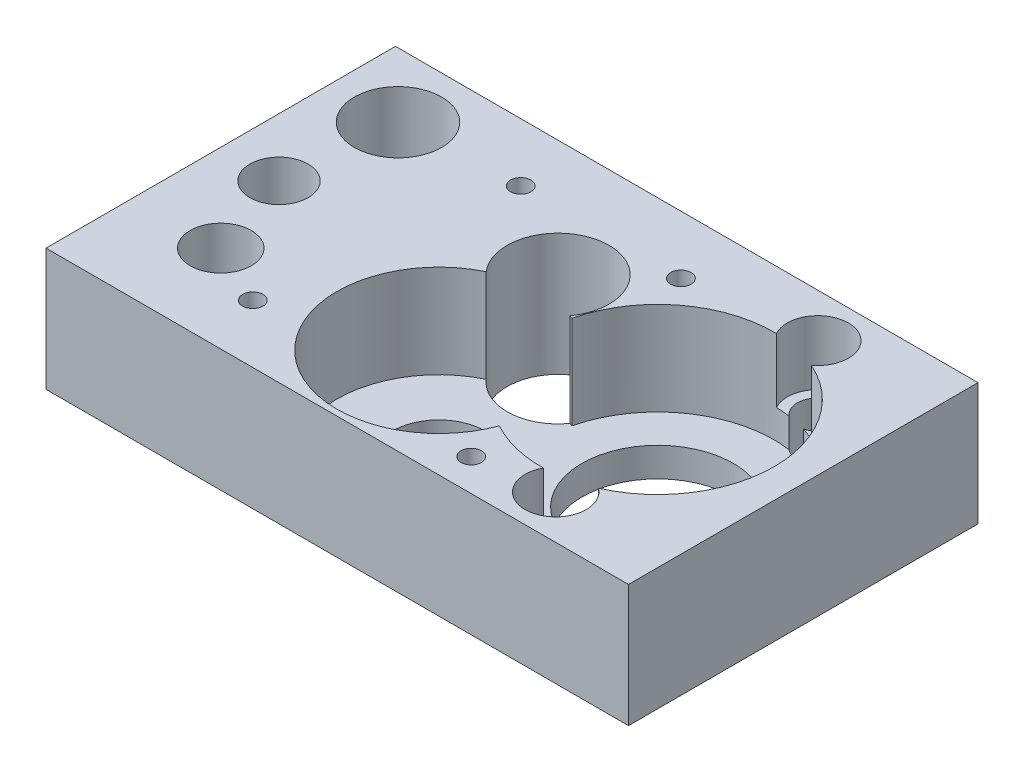
ISO-10303-21;
HEADER;
FILE_DESCRIPTION(('STEP AP214'),'2;1');
FILE_NAME('part.step','',(''),(''),'','','');
FILE_SCHEMA(('AUTOMOTIVE_DESIGN { 1 0 10303 214 1 1 1 1 }'));
ENDSEC;
DATA;
#1=APPLICATION_CONTEXT('core data for automotive mechanical design processes');
#2=APPLICATION_PROTOCOL_DEFINITION('international standard','automotive_design',2000,#1);
#3=PRODUCT_CONTEXT('',#1,'mechanical');
#4=PRODUCT('Part','Part','',(#3));
#5=PRODUCT_RELATED_PRODUCT_CATEGORY('part','',(#4));
#6=PRODUCT_DEFINITION_FORMATION('','',#4);
#7=PRODUCT_DEFINITION_CONTEXT('part definition',#1,'design');
#8=PRODUCT_DEFINITION('design','',#6,#7);
#9=PRODUCT_DEFINITION_SHAPE('','',#8);
#10=(LENGTH_UNIT() NAMED_UNIT(*) SI_UNIT(.MILLI.,.METRE.));
#11=(NAMED_UNIT(*) PLANE_ANGLE_UNIT() SI_UNIT($,.RADIAN.));
#12=(NAMED_UNIT(*) SI_UNIT($,.STERADIAN.) SOLID_ANGLE_UNIT());
#13=UNCERTAINTY_MEASURE_WITH_UNIT(LENGTH_MEASURE(1.E-05),#10,'distance_accuracy_value','');
#14=(GEOMETRIC_REPRESENTATION_CONTEXT(3) GLOBAL_UNCERTAINTY_ASSIGNED_CONTEXT((#13)) GLOBAL_UNIT_ASSIGNED_CONTEXT((#10,
#11,#12)) REPRESENTATION_CONTEXT('',''));
#15=CARTESIAN_POINT('',(0.,0.,0.));
#16=DIRECTION('',(0.,0.,1.));
#17=DIRECTION('',(1.,0.,0.));
#18=AXIS2_PLACEMENT_3D('',#15,#16,#17);
#19=CARTESIAN_POINT('',(16.,0.,10.5));
#20=DIRECTION('',(0.,1.,0.));
#21=DIRECTION('',(0.,0.,1.));
#22=AXIS2_PLACEMENT_3D('',#19,#20,#21);
#23=CYLINDRICAL_SURFACE('',#22,0.699999999999998);
#24=CARTESIAN_POINT('',(16.,0.,10.5));
#25=DIRECTION('',(0.,1.,0.));
#26=DIRECTION('',(0.,0.,1.));
#27=AXIS2_PLACEMENT_3D('',#24,#25,#26);
#28=CIRCLE('',#27,0.699999999999998);
#29=CARTESIAN_POINT('',(16.,0.,11.2));
#30=VERTEX_POINT('',#29);
#31=EDGE_CURVE('E300',#30,#30,#28,.T.);
#32=ORIENTED_EDGE('',*,*,#31,.F.);
#33=EDGE_LOOP('',(#32));
#34=FACE_BOUND('',#33,.T.);
#35=CARTESIAN_POINT('',(16.,2.,10.5));
#36=DIRECTION('',(0.,1.,0.));
#37=DIRECTION('',(0.,0.,1.));
#38=AXIS2_PLACEMENT_3D('',#35,#36,#37);
#39=CIRCLE('',#38,0.699999999999998);
#40=CARTESIAN_POINT('',(16.1772923230258,2.,9.8228239282165));
#41=VERTEX_POINT('',#40);
#42=CARTESIAN_POINT('',(15.5525900299154,2.,9.9616466600188));
#43=VERTEX_POINT('',#42);
#44=EDGE_CURVE('E155',#41,#43,#39,.F.);
#45=ORIENTED_EDGE('',*,*,#44,.F.);
#46=DIRECTION('',(0.,1.,0.));
#47=VECTOR('',#46,1.);
#48=CARTESIAN_POINT('',(16.1772923230258,2.1,9.8228239282165));
#49=LINE('',#48,#47);
#50=CARTESIAN_POINT('',(16.1772923230258,1.,9.8228239282165));
#51=VERTEX_POINT('',#50);
#52=EDGE_CURVE('E420',#41,#51,#49,.F.);
#53=ORIENTED_EDGE('',*,*,#52,.T.);
#54=CARTESIAN_POINT('',(16.,1.,10.5));
#55=DIRECTION('',(0.,1.,0.));
#56=DIRECTION('',(0.,0.,1.));
#57=AXIS2_PLACEMENT_3D('',#54,#55,#56);
#58=CIRCLE('',#57,0.699999999999998);
#59=CARTESIAN_POINT('',(15.5525900299154,1.,9.9616466600188));
#60=VERTEX_POINT('',#59);
#61=EDGE_CURVE('E335',#51,#60,#58,.T.);
#62=ORIENTED_EDGE('',*,*,#61,.T.);
#63=DIRECTION('',(0.,1.,0.));
#64=VECTOR('',#63,1.);
#65=CARTESIAN_POINT('',(15.5525900299154,2.1,9.9616466600188));
#66=LINE('',#65,#64);
#67=EDGE_CURVE('E422',#60,#43,#66,.T.);
#68=ORIENTED_EDGE('',*,*,#67,.T.);
#69=EDGE_LOOP('',(#45,#53,#62,#68));
#70=FACE_BOUND('',#69,.T.);
#71=ADVANCED_FACE('F147',(#34,#70),#23,.F.);
#72=CARTESIAN_POINT('',(16.,0.,1.5));
#73=DIRECTION('',(0.,1.,0.));
#74=DIRECTION('',(0.,0.,1.));
#75=AXIS2_PLACEMENT_3D('',#72,#73,#74);
#76=CYLINDRICAL_SURFACE('',#75,0.699999999999998);
#77=CARTESIAN_POINT('',(16.,0.,1.5));
#78=DIRECTION('',(0.,1.,0.));
#79=DIRECTION('',(0.,0.,1.));
#80=AXIS2_PLACEMENT_3D('',#77,#78,#79);
#81=CIRCLE('',#80,0.699999999999998);
#82=CARTESIAN_POINT('',(16.,0.,2.2));
#83=VERTEX_POINT('',#82);
#84=EDGE_CURVE('E328',#83,#83,#81,.T.);
#85=ORIENTED_EDGE('',*,*,#84,.F.);
#86=EDGE_LOOP('',(#85));
#87=FACE_BOUND('',#86,.T.);
#88=CARTESIAN_POINT('',(16.,2.,1.5));
#89=DIRECTION('',(0.,1.,0.));
#90=DIRECTION('',(0.,0.,1.));
#91=AXIS2_PLACEMENT_3D('',#88,#89,#90);
#92=CIRCLE('',#91,0.699999999999998);
#93=CARTESIAN_POINT('',(15.5525900299154,2.,2.03835333998121));
#94=VERTEX_POINT('',#93);
#95=CARTESIAN_POINT('',(16.1772923230257,2.,2.1771760717835));
#96=VERTEX_POINT('',#95);
#97=EDGE_CURVE('E429',#94,#96,#92,.F.);
#98=ORIENTED_EDGE('',*,*,#97,.F.);
#99=DIRECTION('',(0.,1.,0.));
#100=VECTOR('',#99,1.);
#101=CARTESIAN_POINT('',(15.5525900299154,2.1,2.03835333998121));
#102=LINE('',#101,#100);
#103=CARTESIAN_POINT('',(15.5525900299154,1.,2.03835333998121));
#104=VERTEX_POINT('',#103);
#105=EDGE_CURVE('E275',#94,#104,#102,.F.);
#106=ORIENTED_EDGE('',*,*,#105,.T.);
#107=CARTESIAN_POINT('',(16.,1.,1.5));
#108=DIRECTION('',(0.,1.,0.));
#109=DIRECTION('',(0.,0.,1.));
#110=AXIS2_PLACEMENT_3D('',#107,#108,#109);
#111=CIRCLE('',#110,0.699999999999998);
#112=CARTESIAN_POINT('',(16.1772923230257,1.,2.1771760717835));
#113=VERTEX_POINT('',#112);
#114=EDGE_CURVE('E337',#104,#113,#111,.T.);
#115=ORIENTED_EDGE('',*,*,#114,.T.);
#116=DIRECTION('',(0.,1.,0.));
#117=VECTOR('',#116,1.);
#118=CARTESIAN_POINT('',(16.1772923230257,2.1,2.1771760717835));
#119=LINE('',#118,#117);
#120=EDGE_CURVE('E426',#113,#96,#119,.T.);
#121=ORIENTED_EDGE('',*,*,#120,.T.);
#122=EDGE_LOOP('',(#98,#106,#115,#121));
#123=FACE_BOUND('',#122,.T.);
#124=ADVANCED_FACE('F485',(#87,#123),#76,.F.);
#125=CARTESIAN_POINT('',(2.3,0.,2.2141711607628));
#126=DIRECTION('',(0.,1.,0.));
#127=DIRECTION('',(0.,0.,1.));
#128=AXIS2_PLACEMENT_3D('',#125,#126,#127);
#129=CYLINDRICAL_SURFACE('',#128,0.899999999999999);
#130=CARTESIAN_POINT('',(2.3,0.,2.2141711607628));
#131=DIRECTION('',(0.,1.,0.));
#132=DIRECTION('',(0.,0.,1.));
#133=AXIS2_PLACEMENT_3D('',#130,#131,#132);
#134=CIRCLE('',#133,0.899999999999999);
#135=CARTESIAN_POINT('',(2.3,0.,3.1141711607628));
#136=VERTEX_POINT('',#135);
#137=EDGE_CURVE('E324',#136,#136,#134,.T.);
#138=ORIENTED_EDGE('',*,*,#137,.F.);
#139=EDGE_LOOP('',(#138));
#140=FACE_BOUND('',#139,.T.);
#141=CARTESIAN_POINT('',(2.3,2.,2.2141711607628));
#142=DIRECTION('',(0.,1.,0.));
#143=DIRECTION('',(0.,0.,1.));
#144=AXIS2_PLACEMENT_3D('',#141,#142,#143);
#145=CIRCLE('',#144,0.899999999999999);
#146=CARTESIAN_POINT('',(2.3,2.,3.1141711607628));
#147=VERTEX_POINT('',#146);
#148=EDGE_CURVE('E276',#147,#147,#145,.F.);
#149=ORIENTED_EDGE('',*,*,#148,.F.);
#150=EDGE_LOOP('',(#149));
#151=FACE_BOUND('',#150,.T.);
#152=ADVANCED_FACE('F491',(#140,#151),#129,.F.);
#153=CARTESIAN_POINT('',(3.,0.,9.));
#154=DIRECTION('',(0.,1.,0.));
#155=DIRECTION('',(0.,0.,1.));
#156=AXIS2_PLACEMENT_3D('',#153,#154,#155);
#157=CYLINDRICAL_SURFACE('',#156,0.699999999999999);
#158=CARTESIAN_POINT('',(3.,0.,9.));
#159=DIRECTION('',(0.,1.,0.));
#160=DIRECTION('',(0.,0.,1.));
#161=AXIS2_PLACEMENT_3D('',#158,#159,#160);
#162=CIRCLE('',#161,0.699999999999999);
#163=CARTESIAN_POINT('',(3.,0.,9.7));
#164=VERTEX_POINT('',#163);
#165=EDGE_CURVE('E325',#164,#164,#162,.T.);
#166=ORIENTED_EDGE('',*,*,#165,.F.);
#167=EDGE_LOOP('',(#166));
#168=FACE_BOUND('',#167,.T.);
#169=CARTESIAN_POINT('',(3.,2.,9.));
#170=DIRECTION('',(0.,1.,0.));
#171=DIRECTION('',(0.,0.,1.));
#172=AXIS2_PLACEMENT_3D('',#169,#170,#171);
#173=CIRCLE('',#172,0.699999999999999);
#174=CARTESIAN_POINT('',(3.,2.,9.7));
#175=VERTEX_POINT('',#174);
#176=EDGE_CURVE('E281',#175,#175,#173,.F.);
#177=ORIENTED_EDGE('',*,*,#176,.F.);
#178=EDGE_LOOP('',(#177));
#179=FACE_BOUND('',#178,.T.);
#180=ADVANCED_FACE('F498',(#168,#179),#157,.F.);
#181=CARTESIAN_POINT('',(2.,0.,6.));
#182=DIRECTION('',(0.,1.,0.));
#183=DIRECTION('',(0.,0.,1.));
#184=AXIS2_PLACEMENT_3D('',#181,#182,#183);
#185=CYLINDRICAL_SURFACE('',#184,0.7);
#186=CARTESIAN_POINT('',(2.,0.,6.));
#187=DIRECTION('',(0.,1.,0.));
#188=DIRECTION('',(0.,0.,1.));
#189=AXIS2_PLACEMENT_3D('',#186,#187,#188);
#190=CIRCLE('',#189,0.7);
#191=CARTESIAN_POINT('',(2.,0.,6.7));
#192=VERTEX_POINT('',#191);
#193=EDGE_CURVE('E321',#192,#192,#190,.T.);
#194=ORIENTED_EDGE('',*,*,#193,.F.);
#195=EDGE_LOOP('',(#194));
#196=FACE_BOUND('',#195,.T.);
#197=CARTESIAN_POINT('',(2.,2.,6.));
#198=DIRECTION('',(0.,1.,0.));
#199=DIRECTION('',(0.,0.,1.));
#200=AXIS2_PLACEMENT_3D('',#197,#198,#199);
#201=CIRCLE('',#200,0.7);
#202=CARTESIAN_POINT('',(2.,2.,6.7));
#203=VERTEX_POINT('',#202);
#204=EDGE_CURVE('E430',#203,#203,#201,.F.);
#205=ORIENTED_EDGE('',*,*,#204,.F.);
#206=EDGE_LOOP('',(#205));
#207=FACE_BOUND('',#206,.T.);
#208=ADVANCED_FACE('F509',(#196,#207),#185,.F.);
#209=CARTESIAN_POINT('',(15.,4.2,6.));
#210=DIRECTION('',(0.,-1.,0.));
#211=DIRECTION('',(0.,0.,-1.));
#212=AXIS2_PLACEMENT_3D('',#209,#210,#211);
#213=CYLINDRICAL_SURFACE('',#212,4.);
#214=DIRECTION('',(0.,1.,0.));
#215=VECTOR('',#214,1.);
#216=CARTESIAN_POINT('',(16.6239653482998,3.1,2.34449229962217));
#217=LINE('',#216,#215);
#218=CARTESIAN_POINT('',(16.6239653482998,2.,2.34449229962217));
#219=VERTEX_POINT('',#218);
#220=CARTESIAN_POINT('',(16.6239653482998,4.2,2.34449229962217));
#221=VERTEX_POINT('',#220);
#222=EDGE_CURVE('E290',#219,#221,#217,.T.);
#223=ORIENTED_EDGE('',*,*,#222,.F.);
#224=CARTESIAN_POINT('',(15.,2.,6.));
#225=DIRECTION('',(0.,1.,0.));
#226=DIRECTION('',(0.,0.,1.));
#227=AXIS2_PLACEMENT_3D('',#224,#225,#226);
#228=CIRCLE('',#227,4.);
#229=EDGE_CURVE('E270',#219,#96,#228,.T.);
#230=ORIENTED_EDGE('',*,*,#229,.T.);
#231=ORIENTED_EDGE('',*,*,#120,.F.);
#232=CARTESIAN_POINT('',(15.,1.,6.));
#233=DIRECTION('',(0.,1.,0.));
#234=DIRECTION('',(0.,0.,1.));
#235=AXIS2_PLACEMENT_3D('',#232,#233,#234);
#236=CIRCLE('',#235,4.);
#237=EDGE_CURVE('E349',#51,#113,#236,.T.);
#238=ORIENTED_EDGE('',*,*,#237,.F.);
#239=ORIENTED_EDGE('',*,*,#52,.F.);
#240=CARTESIAN_POINT('',(15.,2.,6.));
#241=DIRECTION('',(0.,1.,0.));
#242=DIRECTION('',(0.,0.,1.));
#243=AXIS2_PLACEMENT_3D('',#240,#241,#242);
#244=CIRCLE('',#243,4.);
#245=CARTESIAN_POINT('',(16.6239653482998,2.,9.65550770037783));
#246=VERTEX_POINT('',#245);
#247=EDGE_CURVE('E162',#41,#246,#244,.T.);
#248=ORIENTED_EDGE('',*,*,#247,.T.);
#249=DIRECTION('',(0.,1.,0.));
#250=VECTOR('',#249,1.);
#251=CARTESIAN_POINT('',(16.6239653482998,3.1,9.65550770037783));
#252=LINE('',#251,#250);
#253=CARTESIAN_POINT('',(16.6239653482998,4.2,9.65550770037783));
#254=VERTEX_POINT('',#253);
#255=EDGE_CURVE('E294',#254,#246,#252,.F.);
#256=ORIENTED_EDGE('',*,*,#255,.F.);
#257=CARTESIAN_POINT('',(15.,4.2,6.));
#258=DIRECTION('',(0.,1.,0.));
#259=DIRECTION('',(0.,0.,1.));
#260=AXIS2_PLACEMENT_3D('',#257,#258,#259);
#261=CIRCLE('',#260,4.);
#262=EDGE_CURVE('E344',#254,#221,#261,.T.);
#263=ORIENTED_EDGE('',*,*,#262,.T.);
#264=EDGE_LOOP('',(#223,#230,#231,#238,#239,#248,#256,#263));
#265=FACE_BOUND('',#264,.T.);
#266=ADVANCED_FACE('F453',(#265),#213,.F.);
#267=DIRECTION('',(0.,1.,0.));
#268=VECTOR('',#267,1.);
#269=CARTESIAN_POINT('',(15.0770934752296,3.1,9.99925700550452));
#270=LINE('',#269,#268);
#271=CARTESIAN_POINT('',(15.0770934752296,2.,9.99925700550453));
#272=VERTEX_POINT('',#271);
#273=CARTESIAN_POINT('',(15.0770934752296,4.2,9.99925700550452));
#274=VERTEX_POINT('',#273);
#275=EDGE_CURVE('E292',#272,#274,#270,.T.);
#276=ORIENTED_EDGE('',*,*,#275,.F.);
#277=CARTESIAN_POINT('',(15.,2.,6.));
#278=DIRECTION('',(0.,1.,0.));
#279=DIRECTION('',(0.,0.,1.));
#280=AXIS2_PLACEMENT_3D('',#277,#278,#279);
#281=CIRCLE('',#280,4.);
#282=EDGE_CURVE('E278',#272,#43,#281,.T.);
#283=ORIENTED_EDGE('',*,*,#282,.T.);
#284=ORIENTED_EDGE('',*,*,#67,.F.);
#285=CARTESIAN_POINT('',(13.0678597308533,1.,9.5024040287125));
#286=VERTEX_POINT('',#285);
#287=EDGE_CURVE('E346',#286,#60,#236,.T.);
#288=ORIENTED_EDGE('',*,*,#287,.F.);
#289=DIRECTION('',(0.,-1.,0.));
#290=VECTOR('',#289,1.);
#291=CARTESIAN_POINT('',(13.0678597308533,2.6,9.5024040287125));
#292=LINE('',#291,#290);
#293=CARTESIAN_POINT('',(13.0678597308533,4.2,9.5024040287125));
#294=VERTEX_POINT('',#293);
#295=EDGE_CURVE('E379',#294,#286,#292,.T.);
#296=ORIENTED_EDGE('',*,*,#295,.F.);
#297=EDGE_CURVE('E340',#294,#274,#261,.T.);
#298=ORIENTED_EDGE('',*,*,#297,.T.);
#299=EDGE_LOOP('',(#276,#283,#284,#288,#296,#298));
#300=FACE_BOUND('',#299,.T.);
#301=ADVANCED_FACE('F442',(#300),#213,.F.);
#302=CARTESIAN_POINT('',(0.,1.,0.));
#303=DIRECTION('',(0.,1.,0.));
#304=DIRECTION('',(0.,0.,1.));
#305=AXIS2_PLACEMENT_3D('',#302,#303,#304);
#306=PLANE('',#305);
#307=ORIENTED_EDGE('',*,*,#114,.F.);
#308=CARTESIAN_POINT('',(11.112533909139,1.,5.05787081968221));
#309=VERTEX_POINT('',#308);
#310=EDGE_CURVE('E339',#104,#309,#236,.T.);
#311=ORIENTED_EDGE('',*,*,#310,.T.);
#312=CARTESIAN_POINT('',(9.78258800671495,1.,8.29534574570485));
#313=DIRECTION('',(0.,1.,0.));
#314=DIRECTION('',(0.,0.,1.));
#315=AXIS2_PLACEMENT_3D('',#312,#313,#314);
#316=CIRCLE('',#315,3.5);
#317=CARTESIAN_POINT('',(11.0070661731994,1.,5.01652686998102));
#318=VERTEX_POINT('',#317);
#319=EDGE_CURVE('E351',#309,#318,#316,.T.);
#320=ORIENTED_EDGE('',*,*,#319,.T.);
#321=CARTESIAN_POINT('',(9.58257569495584,1.,4.));
#322=DIRECTION('',(0.,1.,0.));
#323=DIRECTION('',(0.,0.,1.));
#324=AXIS2_PLACEMENT_3D('',#321,#322,#323);
#325=CIRCLE('',#324,1.75);
#326=CARTESIAN_POINT('',(8.25871336869384,1.,5.1445036221455));
#327=VERTEX_POINT('',#326);
#328=EDGE_CURVE('E394',#327,#318,#325,.T.);
#329=ORIENTED_EDGE('',*,*,#328,.F.);
#330=EDGE_CURVE('E357',#327,#286,#316,.T.);
#331=ORIENTED_EDGE('',*,*,#330,.T.);
#332=ORIENTED_EDGE('',*,*,#287,.T.);
#333=ORIENTED_EDGE('',*,*,#61,.F.);
#334=ORIENTED_EDGE('',*,*,#237,.T.);
#335=EDGE_LOOP('',(#307,#311,#320,#329,#331,#332,#333,#334));
#336=FACE_BOUND('',#335,.T.);
#337=CARTESIAN_POINT('',(9.78258800671495,1.,8.29534574570485));
#338=DIRECTION('',(0.,1.,0.));
#339=DIRECTION('',(0.,0.,1.));
#340=AXIS2_PLACEMENT_3D('',#337,#338,#339);
#341=CIRCLE('',#340,1.6);
#342=CARTESIAN_POINT('',(9.78258800671495,1.,9.89534574570485));
#343=VERTEX_POINT('',#342);
#344=EDGE_CURVE('E382',#343,#343,#341,.T.);
#345=ORIENTED_EDGE('',*,*,#344,.F.);
#346=EDGE_LOOP('',(#345));
#347=FACE_BOUND('',#346,.T.);
#348=CARTESIAN_POINT('',(15.,1.,6.));
#349=DIRECTION('',(0.,1.,0.));
#350=DIRECTION('',(0.,0.,1.));
#351=AXIS2_PLACEMENT_3D('',#348,#349,#350);
#352=CIRCLE('',#351,2.6);
#353=CARTESIAN_POINT('',(15.,1.,8.6));
#354=VERTEX_POINT('',#353);
#355=EDGE_CURVE('E388',#354,#354,#352,.T.);
#356=ORIENTED_EDGE('',*,*,#355,.F.);
#357=EDGE_LOOP('',(#356));
#358=FACE_BOUND('',#357,.T.);
#359=ADVANCED_FACE('F449',(#336,#347,#358),#306,.T.);
#360=CARTESIAN_POINT('',(0.,0.,0.));
#361=DIRECTION('',(0.,1.,0.));
#362=DIRECTION('',(0.,0.,1.));
#363=AXIS2_PLACEMENT_3D('',#360,#361,#362);
#364=PLANE('',#363);
#365=ORIENTED_EDGE('',*,*,#193,.T.);
#366=EDGE_LOOP('',(#365));
#367=FACE_BOUND('',#366,.T.);
#368=ORIENTED_EDGE('',*,*,#165,.T.);
#369=EDGE_LOOP('',(#368));
#370=FACE_BOUND('',#369,.T.);
#371=ORIENTED_EDGE('',*,*,#84,.T.);
#372=EDGE_LOOP('',(#371));
#373=FACE_BOUND('',#372,.T.);
#374=ORIENTED_EDGE('',*,*,#31,.T.);
#375=EDGE_LOOP('',(#374));
#376=FACE_BOUND('',#375,.T.);
#377=CARTESIAN_POINT('',(5.1,0.,10.));
#378=DIRECTION('',(0.,1.,0.));
#379=DIRECTION('',(0.,0.,1.));
#380=AXIS2_PLACEMENT_3D('',#377,#378,#379);
#381=CIRCLE('',#380,0.35);
#382=CARTESIAN_POINT('',(5.1,0.,10.35));
#383=VERTEX_POINT('',#382);
#384=EDGE_CURVE('E301',#383,#383,#381,.T.);
#385=ORIENTED_EDGE('',*,*,#384,.T.);
#386=EDGE_LOOP('',(#385));
#387=FACE_BOUND('',#386,.T.);
#388=CARTESIAN_POINT('',(6.3,0.,2.));
#389=DIRECTION('',(0.,1.,0.));
#390=DIRECTION('',(0.,0.,1.));
#391=AXIS2_PLACEMENT_3D('',#388,#389,#390);
#392=CIRCLE('',#391,0.35);
#393=CARTESIAN_POINT('',(6.3,0.,2.35));
#394=VERTEX_POINT('',#393);
#395=EDGE_CURVE('E307',#394,#394,#392,.T.);
#396=ORIENTED_EDGE('',*,*,#395,.T.);
#397=EDGE_LOOP('',(#396));
#398=FACE_BOUND('',#397,.T.);
#399=CARTESIAN_POINT('',(11.8,0.,2.));
#400=DIRECTION('',(0.,1.,0.));
#401=DIRECTION('',(0.,0.,1.));
#402=AXIS2_PLACEMENT_3D('',#399,#400,#401);
#403=CIRCLE('',#402,0.349999999999999);
#404=CARTESIAN_POINT('',(11.8,0.,2.35));
#405=VERTEX_POINT('',#404);
#406=EDGE_CURVE('E313',#405,#405,#403,.T.);
#407=ORIENTED_EDGE('',*,*,#406,.T.);
#408=EDGE_LOOP('',(#407));
#409=FACE_BOUND('',#408,.T.);
#410=CARTESIAN_POINT('',(13.5,0.,10.9));
#411=DIRECTION('',(0.,1.,0.));
#412=DIRECTION('',(0.,0.,1.));
#413=AXIS2_PLACEMENT_3D('',#410,#411,#412);
#414=CIRCLE('',#413,0.349999999999999);
#415=CARTESIAN_POINT('',(13.5,0.,11.25));
#416=VERTEX_POINT('',#415);
#417=EDGE_CURVE('E296',#416,#416,#414,.T.);
#418=ORIENTED_EDGE('',*,*,#417,.T.);
#419=EDGE_LOOP('',(#418));
#420=FACE_BOUND('',#419,.T.);
#421=ORIENTED_EDGE('',*,*,#137,.T.);
#422=EDGE_LOOP('',(#421));
#423=FACE_BOUND('',#422,.T.);
#424=DIRECTION('',(0.,0.,1.));
#425=VECTOR('',#424,1.);
#426=CARTESIAN_POINT('',(0.,0.,0.));
#427=LINE('',#426,#425);
#428=CARTESIAN_POINT('',(0.,0.,0.));
#429=VERTEX_POINT('',#428);
#430=CARTESIAN_POINT('',(0.,0.,12.));
#431=VERTEX_POINT('',#430);
#432=EDGE_CURVE('E397',#429,#431,#427,.T.);
#433=ORIENTED_EDGE('',*,*,#432,.F.);
#434=DIRECTION('',(1.,0.,0.));
#435=VECTOR('',#434,1.);
#436=CARTESIAN_POINT('',(0.,0.,0.));
#437=LINE('',#436,#435);
#438=CARTESIAN_POINT('',(20.,0.,0.));
#439=VERTEX_POINT('',#438);
#440=EDGE_CURVE('E408',#429,#439,#437,.T.);
#441=ORIENTED_EDGE('',*,*,#440,.T.);
#442=DIRECTION('',(0.,0.,1.));
#443=VECTOR('',#442,1.);
#444=CARTESIAN_POINT('',(20.,0.,0.));
#445=LINE('',#444,#443);
#446=CARTESIAN_POINT('',(20.,0.,12.));
#447=VERTEX_POINT('',#446);
#448=EDGE_CURVE('E405',#439,#447,#445,.T.);
#449=ORIENTED_EDGE('',*,*,#448,.T.);
#450=DIRECTION('',(1.,0.,0.));
#451=VECTOR('',#450,1.);
#452=CARTESIAN_POINT('',(0.,0.,12.));
#453=LINE('',#452,#451);
#454=EDGE_CURVE('E402',#431,#447,#453,.T.);
#455=ORIENTED_EDGE('',*,*,#454,.F.);
#456=EDGE_LOOP('',(#433,#441,#449,#455));
#457=FACE_BOUND('',#456,.T.);
#458=CARTESIAN_POINT('',(9.58257569495584,0.,4.));
#459=DIRECTION('',(0.,1.,0.));
#460=DIRECTION('',(0.,0.,1.));
#461=AXIS2_PLACEMENT_3D('',#458,#459,#460);
#462=CIRCLE('',#461,1.75);
#463=CARTESIAN_POINT('',(9.58257569495584,0.,5.75));
#464=VERTEX_POINT('',#463);
#465=EDGE_CURVE('E391',#464,#464,#462,.T.);
#466=ORIENTED_EDGE('',*,*,#465,.T.);
#467=EDGE_LOOP('',(#466));
#468=FACE_BOUND('',#467,.T.);
#469=CARTESIAN_POINT('',(15.,0.,6.));
#470=DIRECTION('',(0.,1.,0.));
#471=DIRECTION('',(0.,0.,1.));
#472=AXIS2_PLACEMENT_3D('',#469,#470,#471);
#473=CIRCLE('',#472,2.6);
#474=CARTESIAN_POINT('',(15.,0.,8.6));
#475=VERTEX_POINT('',#474);
#476=EDGE_CURVE('E385',#475,#475,#473,.T.);
#477=ORIENTED_EDGE('',*,*,#476,.T.);
#478=EDGE_LOOP('',(#477));
#479=FACE_BOUND('',#478,.T.);
#480=CARTESIAN_POINT('',(9.78258800671495,0.,8.29534574570485));
#481=DIRECTION('',(0.,1.,0.));
#482=DIRECTION('',(0.,0.,1.));
#483=AXIS2_PLACEMENT_3D('',#480,#481,#482);
#484=CIRCLE('',#483,1.6);
#485=CARTESIAN_POINT('',(9.78258800671495,0.,9.89534574570485));
#486=VERTEX_POINT('',#485);
#487=EDGE_CURVE('E381',#486,#486,#484,.T.);
#488=ORIENTED_EDGE('',*,*,#487,.T.);
#489=EDGE_LOOP('',(#488));
#490=FACE_BOUND('',#489,.T.);
#491=ADVANCED_FACE('F514',(#367,#370,#373,#376,#387,#398,#409,#420,#423,#457,#468,#479,#490),
#364,.F.);
#492=CARTESIAN_POINT('',(0.,1.,0.));
#493=DIRECTION('',(1.,0.,0.));
#494=DIRECTION('',(0.,0.,-1.));
#495=AXIS2_PLACEMENT_3D('',#492,#493,#494);
#496=PLANE('',#495);
#497=ORIENTED_EDGE('',*,*,#432,.T.);
#498=DIRECTION('',(0.,-1.,0.));
#499=VECTOR('',#498,1.);
#500=CARTESIAN_POINT('',(0.,1.,12.));
#501=LINE('',#500,#499);
#502=CARTESIAN_POINT('',(0.,4.2,12.));
#503=VERTEX_POINT('',#502);
#504=EDGE_CURVE('E417',#503,#431,#501,.T.);
#505=ORIENTED_EDGE('',*,*,#504,.F.);
#506=DIRECTION('',(0.,0.,-1.));
#507=VECTOR('',#506,1.);
#508=CARTESIAN_POINT('',(0.,4.2,0.));
#509=LINE('',#508,#507);
#510=CARTESIAN_POINT('',(0.,4.2,0.));
#511=VERTEX_POINT('',#510);
#512=EDGE_CURVE('E365',#503,#511,#509,.T.);
#513=ORIENTED_EDGE('',*,*,#512,.T.);
#514=DIRECTION('',(0.,-1.,0.));
#515=VECTOR('',#514,1.);
#516=CARTESIAN_POINT('',(0.,1.,0.));
#517=LINE('',#516,#515);
#518=EDGE_CURVE('E411',#511,#429,#517,.T.);
#519=ORIENTED_EDGE('',*,*,#518,.T.);
#520=EDGE_LOOP('',(#497,#505,#513,#519));
#521=FACE_BOUND('',#520,.T.);
#522=ADVANCED_FACE('F149',(#521),#496,.F.);
#523=CARTESIAN_POINT('',(0.,1.,12.));
#524=DIRECTION('',(0.,0.,-1.));
#525=DIRECTION('',(-1.,0.,0.));
#526=AXIS2_PLACEMENT_3D('',#523,#524,#525);
#527=PLANE('',#526);
#528=ORIENTED_EDGE('',*,*,#454,.T.);
#529=DIRECTION('',(0.,-1.,0.));
#530=VECTOR('',#529,1.);
#531=CARTESIAN_POINT('',(20.,1.,12.));
#532=LINE('',#531,#530);
#533=CARTESIAN_POINT('',(20.,4.2,12.));
#534=VERTEX_POINT('',#533);
#535=EDGE_CURVE('E415',#534,#447,#532,.T.);
#536=ORIENTED_EDGE('',*,*,#535,.F.);
#537=DIRECTION('',(-1.,0.,0.));
#538=VECTOR('',#537,1.);
#539=CARTESIAN_POINT('',(0.,4.2,12.));
#540=LINE('',#539,#538);
#541=EDGE_CURVE('E368',#534,#503,#540,.T.);
#542=ORIENTED_EDGE('',*,*,#541,.T.);
#543=ORIENTED_EDGE('',*,*,#504,.T.);
#544=EDGE_LOOP('',(#528,#536,#542,#543));
#545=FACE_BOUND('',#544,.T.);
#546=ADVANCED_FACE('F530',(#545),#527,.F.);
#547=CARTESIAN_POINT('',(20.,1.,0.));
#548=DIRECTION('',(1.,0.,0.));
#549=DIRECTION('',(0.,0.,-1.));
#550=AXIS2_PLACEMENT_3D('',#547,#548,#549);
#551=PLANE('',#550);
#552=ORIENTED_EDGE('',*,*,#448,.F.);
#553=DIRECTION('',(0.,-1.,0.));
#554=VECTOR('',#553,1.);
#555=CARTESIAN_POINT('',(20.,1.,0.));
#556=LINE('',#555,#554);
#557=CARTESIAN_POINT('',(20.,4.2,0.));
#558=VERTEX_POINT('',#557);
#559=EDGE_CURVE('E413',#558,#439,#556,.T.);
#560=ORIENTED_EDGE('',*,*,#559,.F.);
#561=DIRECTION('',(0.,0.,-1.));
#562=VECTOR('',#561,1.);
#563=CARTESIAN_POINT('',(20.,4.2,0.));
#564=LINE('',#563,#562);
#565=EDGE_CURVE('E355',#534,#558,#564,.T.);
#566=ORIENTED_EDGE('',*,*,#565,.F.);
#567=ORIENTED_EDGE('',*,*,#535,.T.);
#568=EDGE_LOOP('',(#552,#560,#566,#567));
#569=FACE_BOUND('',#568,.T.);
#570=ADVANCED_FACE('F527',(#569),#551,.T.);
#571=CARTESIAN_POINT('',(0.,1.,0.));
#572=DIRECTION('',(0.,0.,-1.));
#573=DIRECTION('',(-1.,0.,0.));
#574=AXIS2_PLACEMENT_3D('',#571,#572,#573);
#575=PLANE('',#574);
#576=ORIENTED_EDGE('',*,*,#440,.F.);
#577=ORIENTED_EDGE('',*,*,#518,.F.);
#578=DIRECTION('',(-1.,0.,0.));
#579=VECTOR('',#578,1.);
#580=CARTESIAN_POINT('',(0.,4.2,0.));
#581=LINE('',#580,#579);
#582=EDGE_CURVE('E362',#558,#511,#581,.T.);
#583=ORIENTED_EDGE('',*,*,#582,.F.);
#584=ORIENTED_EDGE('',*,*,#559,.T.);
#585=EDGE_LOOP('',(#576,#577,#583,#584));
#586=FACE_BOUND('',#585,.T.);
#587=ADVANCED_FACE('F524',(#586),#575,.T.);
#588=CARTESIAN_POINT('',(9.58257569495584,1.,4.));
#589=DIRECTION('',(0.,-1.,0.));
#590=DIRECTION('',(0.,0.,-1.));
#591=AXIS2_PLACEMENT_3D('',#588,#589,#590);
#592=CYLINDRICAL_SURFACE('',#591,1.75);
#593=ORIENTED_EDGE('',*,*,#328,.T.);
#594=DIRECTION('',(0.,-1.,0.));
#595=VECTOR('',#594,1.);
#596=CARTESIAN_POINT('',(11.0070661731994,2.6,5.01652686998102));
#597=LINE('',#596,#595);
#598=CARTESIAN_POINT('',(11.0070661731994,4.2,5.01652686998102));
#599=VERTEX_POINT('',#598);
#600=EDGE_CURVE('E374',#599,#318,#597,.T.);
#601=ORIENTED_EDGE('',*,*,#600,.F.);
#602=CARTESIAN_POINT('',(9.58257569495584,4.2,4.));
#603=DIRECTION('',(0.,1.,0.));
#604=DIRECTION('',(0.,0.,1.));
#605=AXIS2_PLACEMENT_3D('',#602,#603,#604);
#606=CIRCLE('',#605,1.75);
#607=CARTESIAN_POINT('',(8.25871336869384,4.2,5.1445036221455));
#608=VERTEX_POINT('',#607);
#609=EDGE_CURVE('E343',#599,#608,#606,.T.);
#610=ORIENTED_EDGE('',*,*,#609,.T.);
#611=DIRECTION('',(0.,-1.,0.));
#612=VECTOR('',#611,1.);
#613=CARTESIAN_POINT('',(8.25871336869384,2.6,5.1445036221455));
#614=LINE('',#613,#612);
#615=EDGE_CURVE('E371',#327,#608,#614,.F.);
#616=ORIENTED_EDGE('',*,*,#615,.F.);
#617=EDGE_LOOP('',(#593,#601,#610,#616));
#618=FACE_BOUND('',#617,.T.);
#619=ORIENTED_EDGE('',*,*,#465,.F.);
#620=EDGE_LOOP('',(#619));
#621=FACE_BOUND('',#620,.T.);
#622=ADVANCED_FACE('F464',(#618,#621),#592,.F.);
#623=CARTESIAN_POINT('',(15.,1.,6.));
#624=DIRECTION('',(0.,-1.,0.));
#625=DIRECTION('',(0.,0.,-1.));
#626=AXIS2_PLACEMENT_3D('',#623,#624,#625);
#627=CYLINDRICAL_SURFACE('',#626,2.6);
#628=ORIENTED_EDGE('',*,*,#355,.T.);
#629=EDGE_LOOP('',(#628));
#630=FACE_BOUND('',#629,.T.);
#631=ORIENTED_EDGE('',*,*,#476,.F.);
#632=EDGE_LOOP('',(#631));
#633=FACE_BOUND('',#632,.T.);
#634=ADVANCED_FACE('F555',(#630,#633),#627,.F.);
#635=CARTESIAN_POINT('',(9.78258800671495,1.,8.29534574570485));
#636=DIRECTION('',(0.,-1.,0.));
#637=DIRECTION('',(0.,0.,-1.));
#638=AXIS2_PLACEMENT_3D('',#635,#636,#637);
#639=CYLINDRICAL_SURFACE('',#638,1.6);
#640=ORIENTED_EDGE('',*,*,#344,.T.);
#641=EDGE_LOOP('',(#640));
#642=FACE_BOUND('',#641,.T.);
#643=ORIENTED_EDGE('',*,*,#487,.F.);
#644=EDGE_LOOP('',(#643));
#645=FACE_BOUND('',#644,.T.);
#646=ADVANCED_FACE('F481',(#642,#645),#639,.F.);
#647=CARTESIAN_POINT('',(0.,4.2,0.));
#648=DIRECTION('',(0.,1.,0.));
#649=DIRECTION('',(0.,0.,1.));
#650=AXIS2_PLACEMENT_3D('',#647,#648,#649);
#651=PLANE('',#650);
#652=CARTESIAN_POINT('',(16.,4.2,1.5));
#653=DIRECTION('',(0.,1.,0.));
#654=DIRECTION('',(0.,0.,1.));
#655=AXIS2_PLACEMENT_3D('',#652,#653,#654);
#656=CIRCLE('',#655,1.05);
#657=CARTESIAN_POINT('',(15.0770934752296,4.2,2.00074299449548));
#658=VERTEX_POINT('',#657);
#659=EDGE_CURVE('E265',#221,#658,#656,.T.);
#660=ORIENTED_EDGE('',*,*,#659,.F.);
#661=ORIENTED_EDGE('',*,*,#262,.F.);
#662=CARTESIAN_POINT('',(16.,4.2,10.5));
#663=DIRECTION('',(0.,1.,0.));
#664=DIRECTION('',(0.,0.,1.));
#665=AXIS2_PLACEMENT_3D('',#662,#663,#664);
#666=CIRCLE('',#665,1.05);
#667=EDGE_CURVE('E815',#274,#254,#666,.T.);
#668=ORIENTED_EDGE('',*,*,#667,.F.);
#669=ORIENTED_EDGE('',*,*,#297,.F.);
#670=CARTESIAN_POINT('',(9.78258800671495,4.2,8.29534574570485));
#671=DIRECTION('',(0.,1.,0.));
#672=DIRECTION('',(0.,0.,1.));
#673=AXIS2_PLACEMENT_3D('',#670,#671,#672);
#674=CIRCLE('',#673,3.5);
#675=EDGE_CURVE('E352',#608,#294,#674,.T.);
#676=ORIENTED_EDGE('',*,*,#675,.F.);
#677=ORIENTED_EDGE('',*,*,#609,.F.);
#678=CARTESIAN_POINT('',(11.112533909139,4.2,5.0578708196822));
#679=VERTEX_POINT('',#678);
#680=EDGE_CURVE('E356',#679,#599,#674,.T.);
#681=ORIENTED_EDGE('',*,*,#680,.F.);
#682=EDGE_CURVE('E345',#658,#679,#261,.T.);
#683=ORIENTED_EDGE('',*,*,#682,.F.);
#684=EDGE_LOOP('',(#660,#661,#668,#669,#676,#677,#681,#683));
#685=FACE_BOUND('',#684,.T.);
#686=CARTESIAN_POINT('',(3.,4.2,9.));
#687=DIRECTION('',(0.,1.,0.));
#688=DIRECTION('',(0.,0.,1.));
#689=AXIS2_PLACEMENT_3D('',#686,#687,#688);
#690=CIRCLE('',#689,1.05);
#691=CARTESIAN_POINT('',(3.,4.2,10.05));
#692=VERTEX_POINT('',#691);
#693=EDGE_CURVE('E823',#692,#692,#690,.T.);
#694=ORIENTED_EDGE('',*,*,#693,.F.);
#695=EDGE_LOOP('',(#694));
#696=FACE_BOUND('',#695,.T.);
#697=CARTESIAN_POINT('',(2.,4.2,6.));
#698=DIRECTION('',(0.,1.,0.));
#699=DIRECTION('',(0.,0.,1.));
#700=AXIS2_PLACEMENT_3D('',#697,#698,#699);
#701=CIRCLE('',#700,1.);
#702=CARTESIAN_POINT('',(2.,4.2,7.));
#703=VERTEX_POINT('',#702);
#704=EDGE_CURVE('E827',#703,#703,#701,.T.);
#705=ORIENTED_EDGE('',*,*,#704,.F.);
#706=EDGE_LOOP('',(#705));
#707=FACE_BOUND('',#706,.T.);
#708=CARTESIAN_POINT('',(2.3,4.2,2.2141711607628));
#709=DIRECTION('',(0.,1.,0.));
#710=DIRECTION('',(0.,0.,1.));
#711=AXIS2_PLACEMENT_3D('',#708,#709,#710);
#712=CIRCLE('',#711,1.5);
#713=CARTESIAN_POINT('',(2.3,4.2,3.7141711607628));
#714=VERTEX_POINT('',#713);
#715=EDGE_CURVE('E825',#714,#714,#712,.T.);
#716=ORIENTED_EDGE('',*,*,#715,.F.);
#717=EDGE_LOOP('',(#716));
#718=FACE_BOUND('',#717,.T.);
#719=CARTESIAN_POINT('',(5.1,4.2,10.));
#720=DIRECTION('',(0.,1.,0.));
#721=DIRECTION('',(0.,0.,1.));
#722=AXIS2_PLACEMENT_3D('',#719,#720,#721);
#723=CIRCLE('',#722,0.35);
#724=CARTESIAN_POINT('',(5.1,4.2,10.35));
#725=VERTEX_POINT('',#724);
#726=EDGE_CURVE('E297',#725,#725,#723,.T.);
#727=ORIENTED_EDGE('',*,*,#726,.F.);
#728=EDGE_LOOP('',(#727));
#729=FACE_BOUND('',#728,.T.);
#730=CARTESIAN_POINT('',(6.3,4.2,2.));
#731=DIRECTION('',(0.,1.,0.));
#732=DIRECTION('',(0.,0.,1.));
#733=AXIS2_PLACEMENT_3D('',#730,#731,#732);
#734=CIRCLE('',#733,0.35);
#735=CARTESIAN_POINT('',(6.3,4.2,2.35));
#736=VERTEX_POINT('',#735);
#737=EDGE_CURVE('E304',#736,#736,#734,.T.);
#738=ORIENTED_EDGE('',*,*,#737,.F.);
#739=EDGE_LOOP('',(#738));
#740=FACE_BOUND('',#739,.T.);
#741=CARTESIAN_POINT('',(11.8,4.2,2.));
#742=DIRECTION('',(0.,1.,0.));
#743=DIRECTION('',(0.,0.,1.));
#744=AXIS2_PLACEMENT_3D('',#741,#742,#743);
#745=CIRCLE('',#744,0.349999999999999);
#746=CARTESIAN_POINT('',(11.8,4.2,2.35));
#747=VERTEX_POINT('',#746);
#748=EDGE_CURVE('E310',#747,#747,#745,.T.);
#749=ORIENTED_EDGE('',*,*,#748,.F.);
#750=EDGE_LOOP('',(#749));
#751=FACE_BOUND('',#750,.T.);
#752=CARTESIAN_POINT('',(13.5,4.2,10.9));
#753=DIRECTION('',(0.,1.,0.));
#754=DIRECTION('',(0.,0.,1.));
#755=AXIS2_PLACEMENT_3D('',#752,#753,#754);
#756=CIRCLE('',#755,0.349999999999999);
#757=CARTESIAN_POINT('',(13.5,4.2,11.25));
#758=VERTEX_POINT('',#757);
#759=EDGE_CURVE('E316',#758,#758,#756,.T.);
#760=ORIENTED_EDGE('',*,*,#759,.F.);
#761=EDGE_LOOP('',(#760));
#762=FACE_BOUND('',#761,.T.);
#763=ORIENTED_EDGE('',*,*,#565,.T.);
#764=ORIENTED_EDGE('',*,*,#582,.T.);
#765=ORIENTED_EDGE('',*,*,#512,.F.);
#766=ORIENTED_EDGE('',*,*,#541,.F.);
#767=EDGE_LOOP('',(#763,#764,#765,#766));
#768=FACE_BOUND('',#767,.T.);
#769=ADVANCED_FACE('F468',(#685,#696,#707,#718,#729,#740,#751,#762,#768),#651,.T.);
#770=CARTESIAN_POINT('',(9.78258800671495,4.2,8.29534574570485));
#771=DIRECTION('',(0.,-1.,0.));
#772=DIRECTION('',(0.,0.,-1.));
#773=AXIS2_PLACEMENT_3D('',#770,#771,#772);
#774=CYLINDRICAL_SURFACE('',#773,3.5);
#775=ORIENTED_EDGE('',*,*,#675,.T.);
#776=ORIENTED_EDGE('',*,*,#295,.T.);
#777=ORIENTED_EDGE('',*,*,#330,.F.);
#778=ORIENTED_EDGE('',*,*,#615,.T.);
#779=EDGE_LOOP('',(#775,#776,#777,#778));
#780=FACE_BOUND('',#779,.T.);
#781=ADVANCED_FACE('F473',(#780),#774,.F.);
#782=ORIENTED_EDGE('',*,*,#319,.F.);
#783=DIRECTION('',(0.,-1.,0.));
#784=VECTOR('',#783,1.);
#785=CARTESIAN_POINT('',(11.112533909139,2.6,5.0578708196822));
#786=LINE('',#785,#784);
#787=EDGE_CURVE('E376',#309,#679,#786,.F.);
#788=ORIENTED_EDGE('',*,*,#787,.T.);
#789=ORIENTED_EDGE('',*,*,#680,.T.);
#790=ORIENTED_EDGE('',*,*,#600,.T.);
#791=EDGE_LOOP('',(#782,#788,#789,#790));
#792=FACE_BOUND('',#791,.T.);
#793=ADVANCED_FACE('F460',(#792),#774,.F.);
#794=DIRECTION('',(0.,1.,0.));
#795=VECTOR('',#794,1.);
#796=CARTESIAN_POINT('',(15.0770934752296,3.1,2.00074299449547));
#797=LINE('',#796,#795);
#798=CARTESIAN_POINT('',(15.0770934752296,2.,2.00074299449548));
#799=VERTEX_POINT('',#798);
#800=EDGE_CURVE('E13',#658,#799,#797,.F.);
#801=ORIENTED_EDGE('',*,*,#800,.F.);
#802=ORIENTED_EDGE('',*,*,#682,.T.);
#803=ORIENTED_EDGE('',*,*,#787,.F.);
#804=ORIENTED_EDGE('',*,*,#310,.F.);
#805=ORIENTED_EDGE('',*,*,#105,.F.);
#806=CARTESIAN_POINT('',(15.,2.,6.));
#807=DIRECTION('',(0.,1.,0.));
#808=DIRECTION('',(0.,0.,1.));
#809=AXIS2_PLACEMENT_3D('',#806,#807,#808);
#810=CIRCLE('',#809,4.);
#811=EDGE_CURVE('E170',#94,#799,#810,.T.);
#812=ORIENTED_EDGE('',*,*,#811,.T.);
#813=EDGE_LOOP('',(#801,#802,#803,#804,#805,#812));
#814=FACE_BOUND('',#813,.T.);
#815=ADVANCED_FACE('F273',(#814),#213,.F.);
#816=CARTESIAN_POINT('',(13.5,0.,10.9));
#817=DIRECTION('',(0.,1.,0.));
#818=DIRECTION('',(0.,0.,1.));
#819=AXIS2_PLACEMENT_3D('',#816,#817,#818);
#820=CYLINDRICAL_SURFACE('',#819,0.349999999999999);
#821=ORIENTED_EDGE('',*,*,#417,.F.);
#822=EDGE_LOOP('',(#821));
#823=FACE_BOUND('',#822,.T.);
#824=ORIENTED_EDGE('',*,*,#759,.T.);
#825=EDGE_LOOP('',(#824));
#826=FACE_BOUND('',#825,.T.);
#827=ADVANCED_FACE('F501',(#823,#826),#820,.F.);
#828=CARTESIAN_POINT('',(11.8,0.,2.));
#829=DIRECTION('',(0.,1.,0.));
#830=DIRECTION('',(0.,0.,1.));
#831=AXIS2_PLACEMENT_3D('',#828,#829,#830);
#832=CYLINDRICAL_SURFACE('',#831,0.349999999999999);
#833=ORIENTED_EDGE('',*,*,#406,.F.);
#834=EDGE_LOOP('',(#833));
#835=FACE_BOUND('',#834,.T.);
#836=ORIENTED_EDGE('',*,*,#748,.T.);
#837=EDGE_LOOP('',(#836));
#838=FACE_BOUND('',#837,.T.);
#839=ADVANCED_FACE('F505',(#835,#838),#832,.F.);
#840=CARTESIAN_POINT('',(6.3,0.,2.));
#841=DIRECTION('',(0.,1.,0.));
#842=DIRECTION('',(0.,0.,1.));
#843=AXIS2_PLACEMENT_3D('',#840,#841,#842);
#844=CYLINDRICAL_SURFACE('',#843,0.35);
#845=ORIENTED_EDGE('',*,*,#395,.F.);
#846=EDGE_LOOP('',(#845));
#847=FACE_BOUND('',#846,.T.);
#848=ORIENTED_EDGE('',*,*,#737,.T.);
#849=EDGE_LOOP('',(#848));
#850=FACE_BOUND('',#849,.T.);
#851=ADVANCED_FACE('F642',(#847,#850),#844,.F.);
#852=CARTESIAN_POINT('',(5.1,0.,10.));
#853=DIRECTION('',(0.,1.,0.));
#854=DIRECTION('',(0.,0.,1.));
#855=AXIS2_PLACEMENT_3D('',#852,#853,#854);
#856=CYLINDRICAL_SURFACE('',#855,0.35);
#857=ORIENTED_EDGE('',*,*,#384,.F.);
#858=EDGE_LOOP('',(#857));
#859=FACE_BOUND('',#858,.T.);
#860=ORIENTED_EDGE('',*,*,#726,.T.);
#861=EDGE_LOOP('',(#860));
#862=FACE_BOUND('',#861,.T.);
#863=ADVANCED_FACE('F652',(#859,#862),#856,.F.);
#864=CARTESIAN_POINT('',(0.,2.,0.));
#865=DIRECTION('',(0.,1.,0.));
#866=DIRECTION('',(0.,0.,1.));
#867=AXIS2_PLACEMENT_3D('',#864,#865,#866);
#868=PLANE('',#867);
#869=CARTESIAN_POINT('',(2.,2.,6.));
#870=DIRECTION('',(0.,1.,0.));
#871=DIRECTION('',(0.,0.,1.));
#872=AXIS2_PLACEMENT_3D('',#869,#870,#871);
#873=CIRCLE('',#872,1.);
#874=CARTESIAN_POINT('',(2.,2.,7.));
#875=VERTEX_POINT('',#874);
#876=EDGE_CURVE('E832',#875,#875,#873,.F.);
#877=ORIENTED_EDGE('',*,*,#876,.F.);
#878=EDGE_LOOP('',(#877));
#879=FACE_BOUND('',#878,.T.);
#880=ORIENTED_EDGE('',*,*,#204,.T.);
#881=EDGE_LOOP('',(#880));
#882=FACE_BOUND('',#881,.T.);
#883=ADVANCED_FACE('F661',(#879,#882),#868,.T.);
#884=CARTESIAN_POINT('',(2.,-4.24264068711928,6.));
#885=DIRECTION('',(0.,1.,0.));
#886=DIRECTION('',(0.,0.,1.));
#887=AXIS2_PLACEMENT_3D('',#884,#885,#886);
#888=CYLINDRICAL_SURFACE('',#887,1.);
#889=ORIENTED_EDGE('',*,*,#876,.T.);
#890=EDGE_LOOP('',(#889));
#891=FACE_BOUND('',#890,.T.);
#892=ORIENTED_EDGE('',*,*,#704,.T.);
#893=EDGE_LOOP('',(#892));
#894=FACE_BOUND('',#893,.T.);
#895=ADVANCED_FACE('F725',(#891,#894),#888,.F.);
#896=CARTESIAN_POINT('',(0.,2.,0.));
#897=DIRECTION('',(0.,1.,0.));
#898=DIRECTION('',(0.,0.,1.));
#899=AXIS2_PLACEMENT_3D('',#896,#897,#898);
#900=PLANE('',#899);
#901=CARTESIAN_POINT('',(3.,2.,9.));
#902=DIRECTION('',(0.,1.,0.));
#903=DIRECTION('',(0.,0.,1.));
#904=AXIS2_PLACEMENT_3D('',#901,#902,#903);
#905=CIRCLE('',#904,1.05);
#906=CARTESIAN_POINT('',(3.,2.,10.05));
#907=VERTEX_POINT('',#906);
#908=EDGE_CURVE('E819',#907,#907,#905,.F.);
#909=ORIENTED_EDGE('',*,*,#908,.F.);
#910=EDGE_LOOP('',(#909));
#911=FACE_BOUND('',#910,.T.);
#912=ORIENTED_EDGE('',*,*,#176,.T.);
#913=EDGE_LOOP('',(#912));
#914=FACE_BOUND('',#913,.T.);
#915=ADVANCED_FACE('F735',(#911,#914),#900,.T.);
#916=CARTESIAN_POINT('',(3.,-4.24264068711928,9.));
#917=DIRECTION('',(0.,1.,0.));
#918=DIRECTION('',(0.,0.,1.));
#919=AXIS2_PLACEMENT_3D('',#916,#917,#918);
#920=CYLINDRICAL_SURFACE('',#919,1.05);
#921=ORIENTED_EDGE('',*,*,#908,.T.);
#922=EDGE_LOOP('',(#921));
#923=FACE_BOUND('',#922,.T.);
#924=ORIENTED_EDGE('',*,*,#693,.T.);
#925=EDGE_LOOP('',(#924));
#926=FACE_BOUND('',#925,.T.);
#927=ADVANCED_FACE('F745',(#923,#926),#920,.F.);
#928=CARTESIAN_POINT('',(0.,2.,0.));
#929=DIRECTION('',(0.,1.,0.));
#930=DIRECTION('',(0.,0.,1.));
#931=AXIS2_PLACEMENT_3D('',#928,#929,#930);
#932=PLANE('',#931);
#933=CARTESIAN_POINT('',(2.3,2.,2.2141711607628));
#934=DIRECTION('',(0.,1.,0.));
#935=DIRECTION('',(0.,0.,1.));
#936=AXIS2_PLACEMENT_3D('',#933,#934,#935);
#937=CIRCLE('',#936,1.5);
#938=CARTESIAN_POINT('',(2.3,2.,3.7141711607628));
#939=VERTEX_POINT('',#938);
#940=EDGE_CURVE('E284',#939,#939,#937,.F.);
#941=ORIENTED_EDGE('',*,*,#940,.F.);
#942=EDGE_LOOP('',(#941));
#943=FACE_BOUND('',#942,.T.);
#944=ORIENTED_EDGE('',*,*,#148,.T.);
#945=EDGE_LOOP('',(#944));
#946=FACE_BOUND('',#945,.T.);
#947=ADVANCED_FACE('F755',(#943,#946),#932,.T.);
#948=CARTESIAN_POINT('',(2.3,-4.24264068711928,2.2141711607628));
#949=DIRECTION('',(0.,1.,0.));
#950=DIRECTION('',(0.,0.,1.));
#951=AXIS2_PLACEMENT_3D('',#948,#949,#950);
#952=CYLINDRICAL_SURFACE('',#951,1.5);
#953=ORIENTED_EDGE('',*,*,#940,.T.);
#954=EDGE_LOOP('',(#953));
#955=FACE_BOUND('',#954,.T.);
#956=ORIENTED_EDGE('',*,*,#715,.T.);
#957=EDGE_LOOP('',(#956));
#958=FACE_BOUND('',#957,.T.);
#959=ADVANCED_FACE('F765',(#955,#958),#952,.F.);
#960=CARTESIAN_POINT('',(16.,-4.24264068711928,1.5));
#961=DIRECTION('',(0.,1.,0.));
#962=DIRECTION('',(0.,0.,1.));
#963=AXIS2_PLACEMENT_3D('',#960,#961,#962);
#964=CYLINDRICAL_SURFACE('',#963,1.05);
#965=ORIENTED_EDGE('',*,*,#222,.T.);
#966=ORIENTED_EDGE('',*,*,#659,.T.);
#967=ORIENTED_EDGE('',*,*,#800,.T.);
#968=CARTESIAN_POINT('',(16.,2.,1.5));
#969=DIRECTION('',(0.,1.,0.));
#970=DIRECTION('',(0.,0.,1.));
#971=AXIS2_PLACEMENT_3D('',#968,#969,#970);
#972=CIRCLE('',#971,1.05);
#973=EDGE_CURVE('E262',#799,#219,#972,.F.);
#974=ORIENTED_EDGE('',*,*,#973,.T.);
#975=EDGE_LOOP('',(#965,#966,#967,#974));
#976=FACE_BOUND('',#975,.T.);
#977=ADVANCED_FACE('F261',(#976),#964,.F.);
#978=CARTESIAN_POINT('',(0.,2.,0.));
#979=DIRECTION('',(0.,1.,0.));
#980=DIRECTION('',(0.,0.,1.));
#981=AXIS2_PLACEMENT_3D('',#978,#979,#980);
#982=PLANE('',#981);
#983=ORIENTED_EDGE('',*,*,#973,.F.);
#984=ORIENTED_EDGE('',*,*,#811,.F.);
#985=ORIENTED_EDGE('',*,*,#97,.T.);
#986=ORIENTED_EDGE('',*,*,#229,.F.);
#987=EDGE_LOOP('',(#983,#984,#985,#986));
#988=FACE_BOUND('',#987,.T.);
#989=ADVANCED_FACE('F268',(#988),#982,.T.);
#990=CARTESIAN_POINT('',(16.,-4.24264068711928,10.5));
#991=DIRECTION('',(0.,1.,0.));
#992=DIRECTION('',(0.,0.,1.));
#993=AXIS2_PLACEMENT_3D('',#990,#991,#992);
#994=CYLINDRICAL_SURFACE('',#993,1.05);
#995=ORIENTED_EDGE('',*,*,#255,.T.);
#996=CARTESIAN_POINT('',(16.,2.,10.5));
#997=DIRECTION('',(0.,1.,0.));
#998=DIRECTION('',(0.,0.,1.));
#999=AXIS2_PLACEMENT_3D('',#996,#997,#998);
#1000=CIRCLE('',#999,1.05);
#1001=EDGE_CURVE('E814',#246,#272,#1000,.F.);
#1002=ORIENTED_EDGE('',*,*,#1001,.T.);
#1003=ORIENTED_EDGE('',*,*,#275,.T.);
#1004=ORIENTED_EDGE('',*,*,#667,.T.);
#1005=EDGE_LOOP('',(#995,#1002,#1003,#1004));
#1006=FACE_BOUND('',#1005,.T.);
#1007=ADVANCED_FACE('F792',(#1006),#994,.F.);
#1008=CARTESIAN_POINT('',(0.,2.,0.));
#1009=DIRECTION('',(0.,1.,0.));
#1010=DIRECTION('',(0.,0.,1.));
#1011=AXIS2_PLACEMENT_3D('',#1008,#1009,#1010);
#1012=PLANE('',#1011);
#1013=ORIENTED_EDGE('',*,*,#44,.T.);
#1014=ORIENTED_EDGE('',*,*,#282,.F.);
#1015=ORIENTED_EDGE('',*,*,#1001,.F.);
#1016=ORIENTED_EDGE('',*,*,#247,.F.);
#1017=EDGE_LOOP('',(#1013,#1014,#1015,#1016));
#1018=FACE_BOUND('',#1017,.T.);
#1019=ADVANCED_FACE('F435',(#1018),#1012,.T.);
#1020=CLOSED_SHELL('',(#71,#124,#152,#180,#208,#266,#301,#359,#491,#522,#546,#570,#587,#622,
#634,#646,#769,#781,#793,#815,#827,#839,#851,#863,#883,#895,#915,#927,#947,#959,#977,#989,#1007,#1019));
#1021=MANIFOLD_SOLID_BREP('B2',#1020);
#1022=ADVANCED_BREP_SHAPE_REPRESENTATION('',(#18,#1021),#14);
#1023=SHAPE_DEFINITION_REPRESENTATION(#9,#1022);
ENDSEC;
END-ISO-10303-21;
